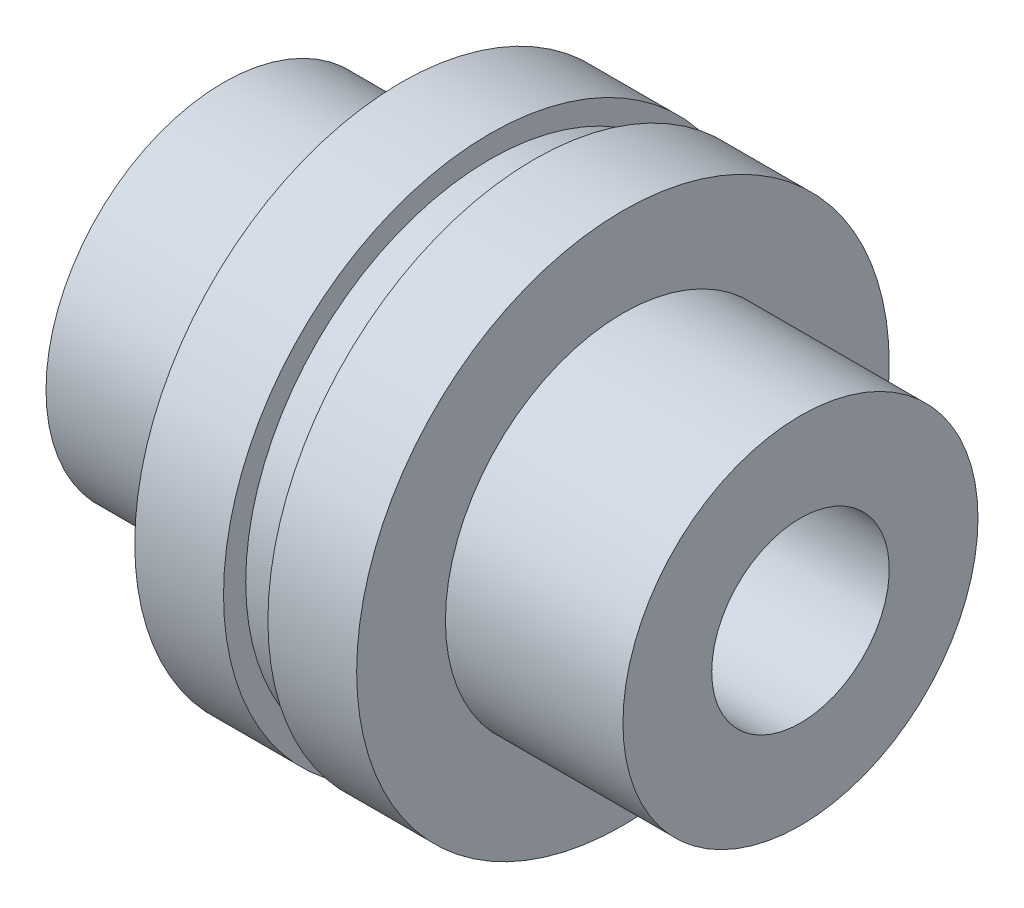
ISO-10303-21;
HEADER;
FILE_DESCRIPTION(('STEP AP214'),'2;1');
FILE_NAME('part.step','',(''),(''),'','','');
FILE_SCHEMA(('AUTOMOTIVE_DESIGN { 1 0 10303 214 1 1 1 1 }'));
ENDSEC;
DATA;
#1=APPLICATION_CONTEXT('core data for automotive mechanical design processes');
#2=APPLICATION_PROTOCOL_DEFINITION('international standard','automotive_design',2000,#1);
#3=PRODUCT_CONTEXT('',#1,'mechanical');
#4=PRODUCT('Part','Part','',(#3));
#5=PRODUCT_RELATED_PRODUCT_CATEGORY('part','',(#4));
#6=PRODUCT_DEFINITION_FORMATION('','',#4);
#7=PRODUCT_DEFINITION_CONTEXT('part definition',#1,'design');
#8=PRODUCT_DEFINITION('design','',#6,#7);
#9=PRODUCT_DEFINITION_SHAPE('','',#8);
#10=(LENGTH_UNIT() NAMED_UNIT(*) SI_UNIT(.MILLI.,.METRE.));
#11=(NAMED_UNIT(*) PLANE_ANGLE_UNIT() SI_UNIT($,.RADIAN.));
#12=(NAMED_UNIT(*) SI_UNIT($,.STERADIAN.) SOLID_ANGLE_UNIT());
#13=UNCERTAINTY_MEASURE_WITH_UNIT(LENGTH_MEASURE(1.E-05),#10,'distance_accuracy_value','');
#14=(GEOMETRIC_REPRESENTATION_CONTEXT(3) GLOBAL_UNCERTAINTY_ASSIGNED_CONTEXT((#13)) GLOBAL_UNIT_ASSIGNED_CONTEXT((#10,
#11,#12)) REPRESENTATION_CONTEXT('',''));
#15=CARTESIAN_POINT('',(0.,0.,0.));
#16=DIRECTION('',(0.,0.,1.));
#17=DIRECTION('',(1.,0.,0.));
#18=AXIS2_PLACEMENT_3D('',#15,#16,#17);
#19=CARTESIAN_POINT('',(0.,0.,0.));
#20=DIRECTION('',(-1.,0.,0.));
#21=DIRECTION('',(0.,0.,1.));
#22=AXIS2_PLACEMENT_3D('',#19,#20,#21);
#23=CYLINDRICAL_SURFACE('',#22,25.4);
#24=CARTESIAN_POINT('',(25.4,0.,0.));
#25=DIRECTION('',(-1.,0.,0.));
#26=DIRECTION('',(0.,0.,1.));
#27=AXIS2_PLACEMENT_3D('',#24,#25,#26);
#28=CIRCLE('',#27,25.4);
#29=CARTESIAN_POINT('',(25.4,0.,25.4));
#30=VERTEX_POINT('',#29);
#31=EDGE_CURVE('E84',#30,#30,#28,.T.);
#32=ORIENTED_EDGE('',*,*,#31,.T.);
#33=EDGE_LOOP('',(#32));
#34=FACE_BOUND('',#33,.T.);
#35=CARTESIAN_POINT('',(0.,0.,0.));
#36=DIRECTION('',(-1.,0.,0.));
#37=DIRECTION('',(0.,0.,1.));
#38=AXIS2_PLACEMENT_3D('',#35,#36,#37);
#39=CIRCLE('',#38,25.4);
#40=CARTESIAN_POINT('',(0.,0.,25.4));
#41=VERTEX_POINT('',#40);
#42=EDGE_CURVE('E12',#41,#41,#39,.T.);
#43=ORIENTED_EDGE('',*,*,#42,.F.);
#44=EDGE_LOOP('',(#43));
#45=FACE_BOUND('',#44,.T.);
#46=ADVANCED_FACE('F44',(#34,#45),#23,.T.);
#47=CARTESIAN_POINT('',(0.,12.7,0.));
#48=DIRECTION('',(-1.,0.,0.));
#49=DIRECTION('',(0.,0.,1.));
#50=AXIS2_PLACEMENT_3D('',#47,#48,#49);
#51=PLANE('',#50);
#52=ORIENTED_EDGE('',*,*,#42,.T.);
#53=EDGE_LOOP('',(#52));
#54=FACE_BOUND('',#53,.T.);
#55=CARTESIAN_POINT('',(0.,0.,0.));
#56=DIRECTION('',(-1.,0.,0.));
#57=DIRECTION('',(0.,0.,1.));
#58=AXIS2_PLACEMENT_3D('',#55,#56,#57);
#59=CIRCLE('',#58,12.7);
#60=CARTESIAN_POINT('',(0.,0.,12.7));
#61=VERTEX_POINT('',#60);
#62=EDGE_CURVE('E50',#61,#61,#59,.T.);
#63=ORIENTED_EDGE('',*,*,#62,.F.);
#64=EDGE_LOOP('',(#63));
#65=FACE_BOUND('',#64,.T.);
#66=ADVANCED_FACE('F102',(#54,#65),#51,.T.);
#67=CARTESIAN_POINT('',(0.,0.,0.));
#68=DIRECTION('',(-1.,0.,0.));
#69=DIRECTION('',(0.,0.,1.));
#70=AXIS2_PLACEMENT_3D('',#67,#68,#69);
#71=CYLINDRICAL_SURFACE('',#70,12.7);
#72=CARTESIAN_POINT('',(82.55,0.,0.));
#73=DIRECTION('',(-1.,0.,0.));
#74=DIRECTION('',(0.,0.,1.));
#75=AXIS2_PLACEMENT_3D('',#72,#73,#74);
#76=CIRCLE('',#75,12.7);
#77=CARTESIAN_POINT('',(82.55,0.,12.7));
#78=VERTEX_POINT('',#77);
#79=EDGE_CURVE('E54',#78,#78,#76,.T.);
#80=ORIENTED_EDGE('',*,*,#79,.F.);
#81=EDGE_LOOP('',(#80));
#82=FACE_BOUND('',#81,.T.);
#83=ORIENTED_EDGE('',*,*,#62,.T.);
#84=EDGE_LOOP('',(#83));
#85=FACE_BOUND('',#84,.T.);
#86=ADVANCED_FACE('F106',(#82,#85),#71,.F.);
#87=CARTESIAN_POINT('',(82.55,12.7,0.));
#88=DIRECTION('',(-1.,0.,0.));
#89=DIRECTION('',(0.,0.,1.));
#90=AXIS2_PLACEMENT_3D('',#87,#88,#89);
#91=PLANE('',#90);
#92=CARTESIAN_POINT('',(82.55,0.,0.));
#93=DIRECTION('',(-1.,0.,0.));
#94=DIRECTION('',(0.,0.,1.));
#95=AXIS2_PLACEMENT_3D('',#92,#93,#94);
#96=CIRCLE('',#95,25.4);
#97=CARTESIAN_POINT('',(82.55,0.,25.4));
#98=VERTEX_POINT('',#97);
#99=EDGE_CURVE('E58',#98,#98,#96,.T.);
#100=ORIENTED_EDGE('',*,*,#99,.F.);
#101=EDGE_LOOP('',(#100));
#102=FACE_BOUND('',#101,.T.);
#103=ORIENTED_EDGE('',*,*,#79,.T.);
#104=EDGE_LOOP('',(#103));
#105=FACE_BOUND('',#104,.T.);
#106=ADVANCED_FACE('F110',(#102,#105),#91,.F.);
#107=CARTESIAN_POINT('',(0.,0.,0.));
#108=DIRECTION('',(-1.,0.,0.));
#109=DIRECTION('',(0.,0.,1.));
#110=AXIS2_PLACEMENT_3D('',#107,#108,#109);
#111=CYLINDRICAL_SURFACE('',#110,25.4);
#112=CARTESIAN_POINT('',(57.15,0.,0.));
#113=DIRECTION('',(-1.,0.,0.));
#114=DIRECTION('',(0.,0.,1.));
#115=AXIS2_PLACEMENT_3D('',#112,#113,#114);
#116=CIRCLE('',#115,25.4);
#117=CARTESIAN_POINT('',(57.15,0.,25.4));
#118=VERTEX_POINT('',#117);
#119=EDGE_CURVE('E63',#118,#118,#116,.T.);
#120=ORIENTED_EDGE('',*,*,#119,.F.);
#121=EDGE_LOOP('',(#120));
#122=FACE_BOUND('',#121,.T.);
#123=ORIENTED_EDGE('',*,*,#99,.T.);
#124=EDGE_LOOP('',(#123));
#125=FACE_BOUND('',#124,.T.);
#126=ADVANCED_FACE('F117',(#122,#125),#111,.T.);
#127=CARTESIAN_POINT('',(57.15,25.4,0.));
#128=DIRECTION('',(-1.,0.,0.));
#129=DIRECTION('',(0.,0.,1.));
#130=AXIS2_PLACEMENT_3D('',#127,#128,#129);
#131=PLANE('',#130);
#132=CARTESIAN_POINT('',(57.15,0.,0.));
#133=DIRECTION('',(-1.,0.,0.));
#134=DIRECTION('',(0.,0.,1.));
#135=AXIS2_PLACEMENT_3D('',#132,#133,#134);
#136=CIRCLE('',#135,38.1);
#137=CARTESIAN_POINT('',(57.15,0.,38.1));
#138=VERTEX_POINT('',#137);
#139=EDGE_CURVE('E66',#138,#138,#136,.T.);
#140=ORIENTED_EDGE('',*,*,#139,.F.);
#141=EDGE_LOOP('',(#140));
#142=FACE_BOUND('',#141,.T.);
#143=ORIENTED_EDGE('',*,*,#119,.T.);
#144=EDGE_LOOP('',(#143));
#145=FACE_BOUND('',#144,.T.);
#146=ADVANCED_FACE('F121',(#142,#145),#131,.F.);
#147=CARTESIAN_POINT('',(0.,0.,0.));
#148=DIRECTION('',(-1.,0.,0.));
#149=DIRECTION('',(0.,0.,1.));
#150=AXIS2_PLACEMENT_3D('',#147,#148,#149);
#151=CYLINDRICAL_SURFACE('',#150,38.1);
#152=CARTESIAN_POINT('',(44.45,0.,0.));
#153=DIRECTION('',(-1.,0.,0.));
#154=DIRECTION('',(0.,0.,1.));
#155=AXIS2_PLACEMENT_3D('',#152,#153,#154);
#156=CIRCLE('',#155,38.1);
#157=CARTESIAN_POINT('',(44.45,0.,38.1));
#158=VERTEX_POINT('',#157);
#159=EDGE_CURVE('E69',#158,#158,#156,.T.);
#160=ORIENTED_EDGE('',*,*,#159,.F.);
#161=EDGE_LOOP('',(#160));
#162=FACE_BOUND('',#161,.T.);
#163=ORIENTED_EDGE('',*,*,#139,.T.);
#164=EDGE_LOOP('',(#163));
#165=FACE_BOUND('',#164,.T.);
#166=ADVANCED_FACE('F125',(#162,#165),#151,.T.);
#167=CARTESIAN_POINT('',(44.45,38.1,0.));
#168=DIRECTION('',(1.,0.,0.));
#169=DIRECTION('',(0.,0.,-1.));
#170=AXIS2_PLACEMENT_3D('',#167,#168,#169);
#171=PLANE('',#170);
#172=CARTESIAN_POINT('',(44.45,0.,0.));
#173=DIRECTION('',(-1.,0.,0.));
#174=DIRECTION('',(0.,0.,1.));
#175=AXIS2_PLACEMENT_3D('',#172,#173,#174);
#176=CIRCLE('',#175,34.925);
#177=CARTESIAN_POINT('',(44.45,0.,34.925));
#178=VERTEX_POINT('',#177);
#179=EDGE_CURVE('E72',#178,#178,#176,.T.);
#180=ORIENTED_EDGE('',*,*,#179,.F.);
#181=EDGE_LOOP('',(#180));
#182=FACE_BOUND('',#181,.T.);
#183=ORIENTED_EDGE('',*,*,#159,.T.);
#184=EDGE_LOOP('',(#183));
#185=FACE_BOUND('',#184,.T.);
#186=ADVANCED_FACE('F129',(#182,#185),#171,.F.);
#187=CARTESIAN_POINT('',(0.,0.,0.));
#188=DIRECTION('',(-1.,0.,0.));
#189=DIRECTION('',(0.,0.,1.));
#190=AXIS2_PLACEMENT_3D('',#187,#188,#189);
#191=CYLINDRICAL_SURFACE('',#190,34.925);
#192=ORIENTED_EDGE('',*,*,#179,.T.);
#193=EDGE_LOOP('',(#192));
#194=FACE_BOUND('',#193,.T.);
#195=CARTESIAN_POINT('',(38.1,0.,0.));
#196=DIRECTION('',(-1.,0.,0.));
#197=DIRECTION('',(0.,0.,1.));
#198=AXIS2_PLACEMENT_3D('',#195,#196,#197);
#199=CIRCLE('',#198,34.925);
#200=CARTESIAN_POINT('',(38.1,0.,34.925));
#201=VERTEX_POINT('',#200);
#202=EDGE_CURVE('E75',#201,#201,#199,.T.);
#203=ORIENTED_EDGE('',*,*,#202,.F.);
#204=EDGE_LOOP('',(#203));
#205=FACE_BOUND('',#204,.T.);
#206=ADVANCED_FACE('F133',(#194,#205),#191,.T.);
#207=CARTESIAN_POINT('',(38.1,38.1,0.));
#208=DIRECTION('',(1.,0.,0.));
#209=DIRECTION('',(0.,0.,-1.));
#210=AXIS2_PLACEMENT_3D('',#207,#208,#209);
#211=PLANE('',#210);
#212=ORIENTED_EDGE('',*,*,#202,.T.);
#213=EDGE_LOOP('',(#212));
#214=FACE_BOUND('',#213,.T.);
#215=CARTESIAN_POINT('',(38.1,0.,0.));
#216=DIRECTION('',(-1.,0.,0.));
#217=DIRECTION('',(0.,0.,1.));
#218=AXIS2_PLACEMENT_3D('',#215,#216,#217);
#219=CIRCLE('',#218,38.1);
#220=CARTESIAN_POINT('',(38.1,0.,38.1));
#221=VERTEX_POINT('',#220);
#222=EDGE_CURVE('E78',#221,#221,#219,.T.);
#223=ORIENTED_EDGE('',*,*,#222,.F.);
#224=EDGE_LOOP('',(#223));
#225=FACE_BOUND('',#224,.T.);
#226=ADVANCED_FACE('F98',(#214,#225),#211,.T.);
#227=CARTESIAN_POINT('',(0.,0.,0.));
#228=DIRECTION('',(-1.,0.,0.));
#229=DIRECTION('',(0.,0.,1.));
#230=AXIS2_PLACEMENT_3D('',#227,#228,#229);
#231=CYLINDRICAL_SURFACE('',#230,38.1);
#232=ORIENTED_EDGE('',*,*,#222,.T.);
#233=EDGE_LOOP('',(#232));
#234=FACE_BOUND('',#233,.T.);
#235=CARTESIAN_POINT('',(25.4,0.,0.));
#236=DIRECTION('',(-1.,0.,0.));
#237=DIRECTION('',(0.,0.,1.));
#238=AXIS2_PLACEMENT_3D('',#235,#236,#237);
#239=CIRCLE('',#238,38.1);
#240=CARTESIAN_POINT('',(25.4,0.,38.1));
#241=VERTEX_POINT('',#240);
#242=EDGE_CURVE('E81',#241,#241,#239,.T.);
#243=ORIENTED_EDGE('',*,*,#242,.F.);
#244=EDGE_LOOP('',(#243));
#245=FACE_BOUND('',#244,.T.);
#246=ADVANCED_FACE('F92',(#234,#245),#231,.T.);
#247=CARTESIAN_POINT('',(25.4,25.4,0.));
#248=DIRECTION('',(-1.,0.,0.));
#249=DIRECTION('',(0.,0.,1.));
#250=AXIS2_PLACEMENT_3D('',#247,#248,#249);
#251=PLANE('',#250);
#252=ORIENTED_EDGE('',*,*,#242,.T.);
#253=EDGE_LOOP('',(#252));
#254=FACE_BOUND('',#253,.T.);
#255=ORIENTED_EDGE('',*,*,#31,.F.);
#256=EDGE_LOOP('',(#255));
#257=FACE_BOUND('',#256,.T.);
#258=ADVANCED_FACE('F90',(#254,#257),#251,.T.);
#259=CLOSED_SHELL('',(#46,#66,#86,#106,#126,#146,#166,#186,#206,#226,#246,#258));
#260=MANIFOLD_SOLID_BREP('B2',#259);
#261=ADVANCED_BREP_SHAPE_REPRESENTATION('',(#18,#260),#14);
#262=SHAPE_DEFINITION_REPRESENTATION(#9,#261);
ENDSEC;
END-ISO-10303-21;
